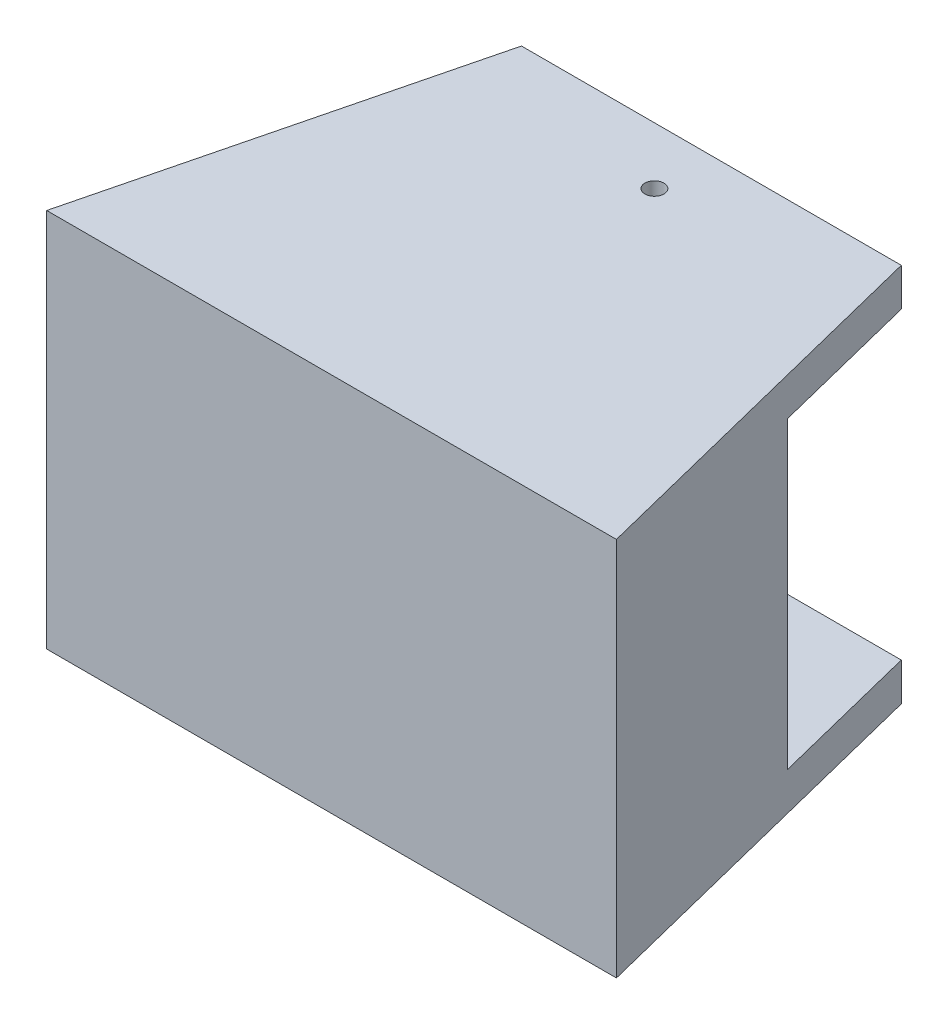
ISO-10303-21;
HEADER;
FILE_DESCRIPTION(('STEP AP214'),'2;1');
FILE_NAME('part.step','',(''),(''),'','','');
FILE_SCHEMA(('AUTOMOTIVE_DESIGN { 1 0 10303 214 1 1 1 1 }'));
ENDSEC;
DATA;
#1=APPLICATION_CONTEXT('core data for automotive mechanical design processes');
#2=APPLICATION_PROTOCOL_DEFINITION('international standard','automotive_design',2000,#1);
#3=PRODUCT_CONTEXT('',#1,'mechanical');
#4=PRODUCT('Part','Part','',(#3));
#5=PRODUCT_RELATED_PRODUCT_CATEGORY('part','',(#4));
#6=PRODUCT_DEFINITION_FORMATION('','',#4);
#7=PRODUCT_DEFINITION_CONTEXT('part definition',#1,'design');
#8=PRODUCT_DEFINITION('design','',#6,#7);
#9=PRODUCT_DEFINITION_SHAPE('','',#8);
#10=(LENGTH_UNIT() NAMED_UNIT(*) SI_UNIT(.MILLI.,.METRE.));
#11=(NAMED_UNIT(*) PLANE_ANGLE_UNIT() SI_UNIT($,.RADIAN.));
#12=(NAMED_UNIT(*) SI_UNIT($,.STERADIAN.) SOLID_ANGLE_UNIT());
#13=UNCERTAINTY_MEASURE_WITH_UNIT(LENGTH_MEASURE(1.E-05),#10,'distance_accuracy_value','');
#14=(GEOMETRIC_REPRESENTATION_CONTEXT(3) GLOBAL_UNCERTAINTY_ASSIGNED_CONTEXT((#13)) GLOBAL_UNIT_ASSIGNED_CONTEXT((#10,
#11,#12)) REPRESENTATION_CONTEXT('',''));
#15=CARTESIAN_POINT('',(0.,0.,0.));
#16=DIRECTION('',(0.,0.,1.));
#17=DIRECTION('',(1.,0.,0.));
#18=AXIS2_PLACEMENT_3D('',#15,#16,#17);
#19=CARTESIAN_POINT('',(-50.,100.,-99.9999999999999));
#20=DIRECTION('',(0.,0.,1.));
#21=DIRECTION('',(1.,0.,0.));
#22=AXIS2_PLACEMENT_3D('',#19,#20,#21);
#23=PLANE('',#22);
#24=DIRECTION('',(0.,-1.,0.));
#25=VECTOR('',#24,1.);
#26=CARTESIAN_POINT('',(50.,100.,-100.));
#27=LINE('',#26,#25);
#28=CARTESIAN_POINT('',(50.,100.,-100.));
#29=VERTEX_POINT('',#28);
#30=CARTESIAN_POINT('',(50.,90.,-100.));
#31=VERTEX_POINT('',#30);
#32=EDGE_CURVE('E142',#29,#31,#27,.T.);
#33=ORIENTED_EDGE('',*,*,#32,.T.);
#34=DIRECTION('',(1.,0.,0.));
#35=VECTOR('',#34,1.);
#36=CARTESIAN_POINT('',(-100.,90.,-100.));
#37=LINE('',#36,#35);
#38=CARTESIAN_POINT('',(-50.,90.,-100.));
#39=VERTEX_POINT('',#38);
#40=EDGE_CURVE('E170',#39,#31,#37,.T.);
#41=ORIENTED_EDGE('',*,*,#40,.F.);
#42=DIRECTION('',(0.,-1.,0.));
#43=VECTOR('',#42,1.);
#44=CARTESIAN_POINT('',(-50.,100.,-99.9999999999999));
#45=LINE('',#44,#43);
#46=CARTESIAN_POINT('',(-50.,100.,-99.9999999999999));
#47=VERTEX_POINT('',#46);
#48=EDGE_CURVE('E137',#47,#39,#45,.T.);
#49=ORIENTED_EDGE('',*,*,#48,.F.);
#50=DIRECTION('',(-1.,0.,0.));
#51=VECTOR('',#50,1.);
#52=CARTESIAN_POINT('',(-50.,100.,-99.9999999999999));
#53=LINE('',#52,#51);
#54=EDGE_CURVE('E158',#29,#47,#53,.T.);
#55=ORIENTED_EDGE('',*,*,#54,.F.);
#56=EDGE_LOOP('',(#33,#41,#49,#55));
#57=FACE_BOUND('',#56,.T.);
#58=ADVANCED_FACE('F39',(#57),#23,.F.);
#59=CARTESIAN_POINT('',(50.,100.,-100.));
#60=DIRECTION('',(-0.970142500145332,0.,0.242535625036333));
#61=DIRECTION('',(0.242535625036333,0.,0.970142500145332));
#62=AXIS2_PLACEMENT_3D('',#59,#60,#61);
#63=PLANE('',#62);
#64=DIRECTION('',(-0.242535625036333,0.,-0.970142500145332));
#65=VECTOR('',#64,1.);
#66=CARTESIAN_POINT('',(50.,100.,-100.));
#67=LINE('',#66,#65);
#68=CARTESIAN_POINT('',(75.,100.,0.));
#69=VERTEX_POINT('',#68);
#70=EDGE_CURVE('E119',#69,#29,#67,.T.);
#71=ORIENTED_EDGE('',*,*,#70,.F.);
#72=DIRECTION('',(0.,1.,0.));
#73=VECTOR('',#72,1.);
#74=CARTESIAN_POINT('',(75.,0.,0.));
#75=LINE('',#74,#73);
#76=CARTESIAN_POINT('',(75.,0.,0.));
#77=VERTEX_POINT('',#76);
#78=EDGE_CURVE('E105',#77,#69,#75,.T.);
#79=ORIENTED_EDGE('',*,*,#78,.F.);
#80=DIRECTION('',(-0.242535625036333,0.,-0.970142500145332));
#81=VECTOR('',#80,1.);
#82=CARTESIAN_POINT('',(50.,0.,-100.));
#83=LINE('',#82,#81);
#84=CARTESIAN_POINT('',(50.,0.,-100.));
#85=VERTEX_POINT('',#84);
#86=EDGE_CURVE('E116',#77,#85,#83,.T.);
#87=ORIENTED_EDGE('',*,*,#86,.T.);
#88=CARTESIAN_POINT('',(50.,10.,-100.));
#89=VERTEX_POINT('',#88);
#90=EDGE_CURVE('E140',#89,#85,#27,.T.);
#91=ORIENTED_EDGE('',*,*,#90,.F.);
#92=DIRECTION('',(0.242535625036333,0.,0.970142500145332));
#93=VECTOR('',#92,1.);
#94=CARTESIAN_POINT('',(50.,10.,-100.));
#95=LINE('',#94,#93);
#96=CARTESIAN_POINT('',(60.,10.,-60.));
#97=VERTEX_POINT('',#96);
#98=EDGE_CURVE('E130',#89,#97,#95,.T.);
#99=ORIENTED_EDGE('',*,*,#98,.T.);
#100=DIRECTION('',(0.,1.,0.));
#101=VECTOR('',#100,1.);
#102=CARTESIAN_POINT('',(60.,100.,-60.));
#103=LINE('',#102,#101);
#104=CARTESIAN_POINT('',(60.,90.,-60.));
#105=VERTEX_POINT('',#104);
#106=EDGE_CURVE('E167',#97,#105,#103,.T.);
#107=ORIENTED_EDGE('',*,*,#106,.T.);
#108=DIRECTION('',(-0.242535625036333,0.,-0.970142500145332));
#109=VECTOR('',#108,1.);
#110=CARTESIAN_POINT('',(50.,90.,-100.));
#111=LINE('',#110,#109);
#112=EDGE_CURVE('E125',#105,#31,#111,.T.);
#113=ORIENTED_EDGE('',*,*,#112,.T.);
#114=ORIENTED_EDGE('',*,*,#32,.F.);
#115=EDGE_LOOP('',(#71,#79,#87,#91,#99,#107,#113,#114));
#116=FACE_BOUND('',#115,.T.);
#117=ADVANCED_FACE('F41',(#116),#63,.F.);
#118=CARTESIAN_POINT('',(-50.,10.,-100.));
#119=VERTEX_POINT('',#118);
#120=CARTESIAN_POINT('',(-50.,0.,-99.9999999999999));
#121=VERTEX_POINT('',#120);
#122=EDGE_CURVE('E141',#119,#121,#45,.T.);
#123=ORIENTED_EDGE('',*,*,#122,.F.);
#124=DIRECTION('',(1.,0.,0.));
#125=VECTOR('',#124,1.);
#126=CARTESIAN_POINT('',(-100.,10.,-100.));
#127=LINE('',#126,#125);
#128=EDGE_CURVE('E156',#119,#89,#127,.T.);
#129=ORIENTED_EDGE('',*,*,#128,.T.);
#130=ORIENTED_EDGE('',*,*,#90,.T.);
#131=DIRECTION('',(-1.,0.,0.));
#132=VECTOR('',#131,1.);
#133=CARTESIAN_POINT('',(-50.,0.,-99.9999999999999));
#134=LINE('',#133,#132);
#135=EDGE_CURVE('E124',#85,#121,#134,.T.);
#136=ORIENTED_EDGE('',*,*,#135,.T.);
#137=EDGE_LOOP('',(#123,#129,#130,#136));
#138=FACE_BOUND('',#137,.T.);
#139=ADVANCED_FACE('F155',(#138),#23,.F.);
#140=CARTESIAN_POINT('',(-50.,100.,-99.9999999999999));
#141=DIRECTION('',(0.970142500145332,0.,0.242535625036333));
#142=DIRECTION('',(0.242535625036333,0.,-0.970142500145332));
#143=AXIS2_PLACEMENT_3D('',#140,#141,#142);
#144=PLANE('',#143);
#145=DIRECTION('',(-0.242535625036333,0.,0.970142500145332));
#146=VECTOR('',#145,1.);
#147=CARTESIAN_POINT('',(-50.,0.,-99.9999999999999));
#148=LINE('',#147,#146);
#149=CARTESIAN_POINT('',(-75.,0.,0.));
#150=VERTEX_POINT('',#149);
#151=EDGE_CURVE('E127',#121,#150,#148,.T.);
#152=ORIENTED_EDGE('',*,*,#151,.T.);
#153=DIRECTION('',(0.,1.,0.));
#154=VECTOR('',#153,1.);
#155=CARTESIAN_POINT('',(-75.,0.,0.));
#156=LINE('',#155,#154);
#157=CARTESIAN_POINT('',(-75.,100.,0.));
#158=VERTEX_POINT('',#157);
#159=EDGE_CURVE('E55',#150,#158,#156,.T.);
#160=ORIENTED_EDGE('',*,*,#159,.T.);
#161=DIRECTION('',(-0.242535625036333,0.,0.970142500145332));
#162=VECTOR('',#161,1.);
#163=CARTESIAN_POINT('',(-50.,100.,-99.9999999999999));
#164=LINE('',#163,#162);
#165=EDGE_CURVE('E133',#47,#158,#164,.T.);
#166=ORIENTED_EDGE('',*,*,#165,.F.);
#167=ORIENTED_EDGE('',*,*,#48,.T.);
#168=DIRECTION('',(-0.242535625036333,0.,0.970142500145332));
#169=VECTOR('',#168,1.);
#170=CARTESIAN_POINT('',(-50.,90.,-99.9999999999999));
#171=LINE('',#170,#169);
#172=CARTESIAN_POINT('',(-60.,90.,-60.));
#173=VERTEX_POINT('',#172);
#174=EDGE_CURVE('E11',#39,#173,#171,.T.);
#175=ORIENTED_EDGE('',*,*,#174,.T.);
#176=DIRECTION('',(0.,-1.,0.));
#177=VECTOR('',#176,1.);
#178=CARTESIAN_POINT('',(-60.,100.,-60.));
#179=LINE('',#178,#177);
#180=CARTESIAN_POINT('',(-60.,10.,-60.));
#181=VERTEX_POINT('',#180);
#182=EDGE_CURVE('E145',#173,#181,#179,.T.);
#183=ORIENTED_EDGE('',*,*,#182,.T.);
#184=DIRECTION('',(0.242535625036333,0.,-0.970142500145332));
#185=VECTOR('',#184,1.);
#186=CARTESIAN_POINT('',(-50.,10.,-99.9999999999999));
#187=LINE('',#186,#185);
#188=EDGE_CURVE('E48',#181,#119,#187,.T.);
#189=ORIENTED_EDGE('',*,*,#188,.T.);
#190=ORIENTED_EDGE('',*,*,#122,.T.);
#191=EDGE_LOOP('',(#152,#160,#166,#167,#175,#183,#189,#190));
#192=FACE_BOUND('',#191,.T.);
#193=ADVANCED_FACE('F151',(#192),#144,.F.);
#194=CARTESIAN_POINT('',(0.,100.,0.));
#195=DIRECTION('',(0.,1.,0.));
#196=DIRECTION('',(0.,0.,1.));
#197=AXIS2_PLACEMENT_3D('',#194,#195,#196);
#198=PLANE('',#197);
#199=DIRECTION('',(-1.,0.,0.));
#200=VECTOR('',#199,1.);
#201=CARTESIAN_POINT('',(-75.,100.,0.));
#202=LINE('',#201,#200);
#203=EDGE_CURVE('E111',#69,#158,#202,.T.);
#204=ORIENTED_EDGE('',*,*,#203,.F.);
#205=ORIENTED_EDGE('',*,*,#70,.T.);
#206=ORIENTED_EDGE('',*,*,#54,.T.);
#207=ORIENTED_EDGE('',*,*,#165,.T.);
#208=EDGE_LOOP('',(#204,#205,#206,#207));
#209=FACE_BOUND('',#208,.T.);
#210=CARTESIAN_POINT('',(0.,100.,-85.));
#211=DIRECTION('',(0.,1.,0.));
#212=DIRECTION('',(0.,0.,1.));
#213=AXIS2_PLACEMENT_3D('',#210,#211,#212);
#214=CIRCLE('',#213,2.5);
#215=CARTESIAN_POINT('',(0.,100.,-82.5));
#216=VERTEX_POINT('',#215);
#217=EDGE_CURVE('E174',#216,#216,#214,.T.);
#218=ORIENTED_EDGE('',*,*,#217,.F.);
#219=EDGE_LOOP('',(#218));
#220=FACE_BOUND('',#219,.T.);
#221=ADVANCED_FACE('F217',(#209,#220),#198,.T.);
#222=CARTESIAN_POINT('',(0.,0.,0.));
#223=DIRECTION('',(0.,1.,0.));
#224=DIRECTION('',(0.,0.,1.));
#225=AXIS2_PLACEMENT_3D('',#222,#223,#224);
#226=PLANE('',#225);
#227=CARTESIAN_POINT('',(0.,0.,-85.));
#228=DIRECTION('',(0.,1.,0.));
#229=DIRECTION('',(0.,0.,1.));
#230=AXIS2_PLACEMENT_3D('',#227,#228,#229);
#231=CIRCLE('',#230,2.5);
#232=CARTESIAN_POINT('',(0.,0.,-82.5));
#233=VERTEX_POINT('',#232);
#234=EDGE_CURVE('E183',#233,#233,#231,.T.);
#235=ORIENTED_EDGE('',*,*,#234,.T.);
#236=EDGE_LOOP('',(#235));
#237=FACE_BOUND('',#236,.T.);
#238=ORIENTED_EDGE('',*,*,#86,.F.);
#239=DIRECTION('',(-1.,0.,0.));
#240=VECTOR('',#239,1.);
#241=CARTESIAN_POINT('',(-75.,0.,0.));
#242=LINE('',#241,#240);
#243=EDGE_CURVE('E102',#77,#150,#242,.T.);
#244=ORIENTED_EDGE('',*,*,#243,.T.);
#245=ORIENTED_EDGE('',*,*,#151,.F.);
#246=ORIENTED_EDGE('',*,*,#135,.F.);
#247=EDGE_LOOP('',(#238,#244,#245,#246));
#248=FACE_BOUND('',#247,.T.);
#249=ADVANCED_FACE('F122',(#237,#248),#226,.F.);
#250=CARTESIAN_POINT('',(-100.,90.,-100.));
#251=DIRECTION('',(0.,1.,0.));
#252=DIRECTION('',(0.,0.,1.));
#253=AXIS2_PLACEMENT_3D('',#250,#251,#252);
#254=PLANE('',#253);
#255=CARTESIAN_POINT('',(0.,90.,-85.));
#256=DIRECTION('',(0.,1.,0.));
#257=DIRECTION('',(0.,0.,1.));
#258=AXIS2_PLACEMENT_3D('',#255,#256,#257);
#259=CIRCLE('',#258,2.5);
#260=CARTESIAN_POINT('',(0.,90.,-82.5));
#261=VERTEX_POINT('',#260);
#262=EDGE_CURVE('E180',#261,#261,#259,.T.);
#263=ORIENTED_EDGE('',*,*,#262,.T.);
#264=EDGE_LOOP('',(#263));
#265=FACE_BOUND('',#264,.T.);
#266=DIRECTION('',(1.,0.,0.));
#267=VECTOR('',#266,1.);
#268=CARTESIAN_POINT('',(-100.,90.,-60.));
#269=LINE('',#268,#267);
#270=EDGE_CURVE('E171',#173,#105,#269,.T.);
#271=ORIENTED_EDGE('',*,*,#270,.F.);
#272=ORIENTED_EDGE('',*,*,#174,.F.);
#273=ORIENTED_EDGE('',*,*,#40,.T.);
#274=ORIENTED_EDGE('',*,*,#112,.F.);
#275=EDGE_LOOP('',(#271,#272,#273,#274));
#276=FACE_BOUND('',#275,.T.);
#277=ADVANCED_FACE('F191',(#265,#276),#254,.F.);
#278=CARTESIAN_POINT('',(-100.,10.,-100.));
#279=DIRECTION('',(0.,-1.,0.));
#280=DIRECTION('',(0.,0.,-1.));
#281=AXIS2_PLACEMENT_3D('',#278,#279,#280);
#282=PLANE('',#281);
#283=CARTESIAN_POINT('',(0.,10.,-85.));
#284=DIRECTION('',(0.,-1.,0.));
#285=DIRECTION('',(0.,0.,-1.));
#286=AXIS2_PLACEMENT_3D('',#283,#284,#285);
#287=CIRCLE('',#286,2.5);
#288=CARTESIAN_POINT('',(0.,10.,-87.5));
#289=VERTEX_POINT('',#288);
#290=EDGE_CURVE('E43',#289,#289,#287,.T.);
#291=ORIENTED_EDGE('',*,*,#290,.T.);
#292=EDGE_LOOP('',(#291));
#293=FACE_BOUND('',#292,.T.);
#294=ORIENTED_EDGE('',*,*,#128,.F.);
#295=ORIENTED_EDGE('',*,*,#188,.F.);
#296=DIRECTION('',(1.,0.,0.));
#297=VECTOR('',#296,1.);
#298=CARTESIAN_POINT('',(-100.,10.,-60.));
#299=LINE('',#298,#297);
#300=EDGE_CURVE('E63',#181,#97,#299,.T.);
#301=ORIENTED_EDGE('',*,*,#300,.T.);
#302=ORIENTED_EDGE('',*,*,#98,.F.);
#303=EDGE_LOOP('',(#294,#295,#301,#302));
#304=FACE_BOUND('',#303,.T.);
#305=ADVANCED_FACE('F193',(#293,#304),#282,.F.);
#306=CARTESIAN_POINT('',(-100.,90.,-60.));
#307=DIRECTION('',(0.,0.,1.));
#308=DIRECTION('',(1.,0.,0.));
#309=AXIS2_PLACEMENT_3D('',#306,#307,#308);
#310=PLANE('',#309);
#311=ORIENTED_EDGE('',*,*,#300,.F.);
#312=ORIENTED_EDGE('',*,*,#182,.F.);
#313=ORIENTED_EDGE('',*,*,#270,.T.);
#314=ORIENTED_EDGE('',*,*,#106,.F.);
#315=EDGE_LOOP('',(#311,#312,#313,#314));
#316=FACE_BOUND('',#315,.T.);
#317=ADVANCED_FACE('F192',(#316),#310,.F.);
#318=CARTESIAN_POINT('',(0.,0.,-85.));
#319=DIRECTION('',(0.,1.,0.));
#320=DIRECTION('',(0.,0.,1.));
#321=AXIS2_PLACEMENT_3D('',#318,#319,#320);
#322=CYLINDRICAL_SURFACE('',#321,2.5);
#323=ORIENTED_EDGE('',*,*,#234,.F.);
#324=EDGE_LOOP('',(#323));
#325=FACE_BOUND('',#324,.T.);
#326=ORIENTED_EDGE('',*,*,#290,.F.);
#327=EDGE_LOOP('',(#326));
#328=FACE_BOUND('',#327,.T.);
#329=ADVANCED_FACE('F202',(#325,#328),#322,.F.);
#330=ORIENTED_EDGE('',*,*,#217,.T.);
#331=EDGE_LOOP('',(#330));
#332=FACE_BOUND('',#331,.T.);
#333=ORIENTED_EDGE('',*,*,#262,.F.);
#334=EDGE_LOOP('',(#333));
#335=FACE_BOUND('',#334,.T.);
#336=ADVANCED_FACE('F231',(#332,#335),#322,.F.);
#337=CARTESIAN_POINT('',(-75.,0.,0.));
#338=DIRECTION('',(0.,0.,-1.));
#339=DIRECTION('',(-1.,0.,0.));
#340=AXIS2_PLACEMENT_3D('',#337,#338,#339);
#341=PLANE('',#340);
#342=ORIENTED_EDGE('',*,*,#203,.T.);
#343=ORIENTED_EDGE('',*,*,#159,.F.);
#344=ORIENTED_EDGE('',*,*,#243,.F.);
#345=ORIENTED_EDGE('',*,*,#78,.T.);
#346=EDGE_LOOP('',(#342,#343,#344,#345));
#347=FACE_BOUND('',#346,.T.);
#348=ADVANCED_FACE('F104',(#347),#341,.F.);
#349=CLOSED_SHELL('',(#58,#117,#139,#193,#221,#249,#277,#305,#317,#329,#336,#348));
#350=MANIFOLD_SOLID_BREP('B2',#349);
#351=ADVANCED_BREP_SHAPE_REPRESENTATION('',(#18,#350),#14);
#352=SHAPE_DEFINITION_REPRESENTATION(#9,#351);
ENDSEC;
END-ISO-10303-21;
